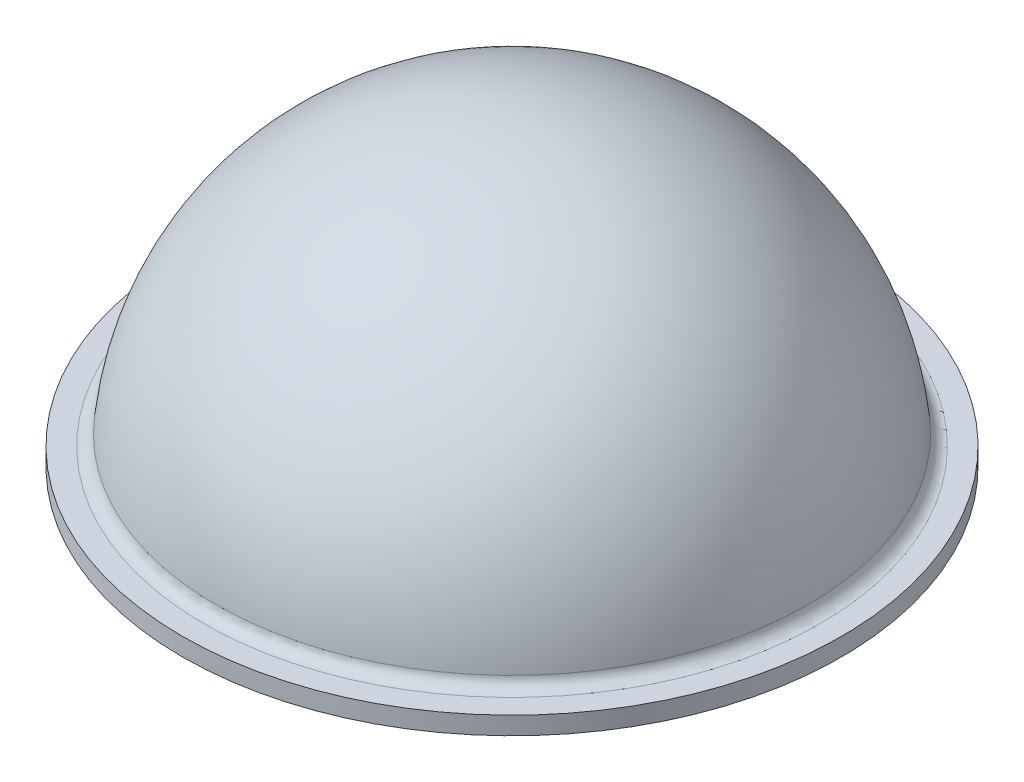
ISO-10303-21;
HEADER;
FILE_DESCRIPTION(('STEP AP214'),'2;1');
FILE_NAME('part.step','',(''),(''),'','','');
FILE_SCHEMA(('AUTOMOTIVE_DESIGN { 1 0 10303 214 1 1 1 1 }'));
ENDSEC;
DATA;
#1=APPLICATION_CONTEXT('core data for automotive mechanical design processes');
#2=APPLICATION_PROTOCOL_DEFINITION('international standard','automotive_design',2000,#1);
#3=PRODUCT_CONTEXT('',#1,'mechanical');
#4=PRODUCT('Part','Part','',(#3));
#5=PRODUCT_RELATED_PRODUCT_CATEGORY('part','',(#4));
#6=PRODUCT_DEFINITION_FORMATION('','',#4);
#7=PRODUCT_DEFINITION_CONTEXT('part definition',#1,'design');
#8=PRODUCT_DEFINITION('design','',#6,#7);
#9=PRODUCT_DEFINITION_SHAPE('','',#8);
#10=(LENGTH_UNIT() NAMED_UNIT(*) SI_UNIT(.MILLI.,.METRE.));
#11=(NAMED_UNIT(*) PLANE_ANGLE_UNIT() SI_UNIT($,.RADIAN.));
#12=(NAMED_UNIT(*) SI_UNIT($,.STERADIAN.) SOLID_ANGLE_UNIT());
#13=UNCERTAINTY_MEASURE_WITH_UNIT(LENGTH_MEASURE(1.E-05),#10,'distance_accuracy_value','');
#14=(GEOMETRIC_REPRESENTATION_CONTEXT(3) GLOBAL_UNCERTAINTY_ASSIGNED_CONTEXT((#13)) GLOBAL_UNIT_ASSIGNED_CONTEXT((#10,
#11,#12)) REPRESENTATION_CONTEXT('',''));
#15=CARTESIAN_POINT('',(0.,0.,0.));
#16=DIRECTION('',(0.,0.,1.));
#17=DIRECTION('',(1.,0.,0.));
#18=AXIS2_PLACEMENT_3D('',#15,#16,#17);
#19=CARTESIAN_POINT('',(0.,3.,0.));
#20=DIRECTION('',(0.,-1.,0.));
#21=DIRECTION('',(0.,0.,-1.));
#22=AXIS2_PLACEMENT_3D('',#19,#20,#21);
#23=TOROIDAL_SURFACE('',#22,49.9099188538711,3.);
#24=CARTESIAN_POINT('',(0.,2.82,0.));
#25=DIRECTION('',(0.,-1.,0.));
#26=DIRECTION('',(0.,0.,-1.));
#27=AXIS2_PLACEMENT_3D('',#24,#25,#26);
#28=CIRCLE('',#27,46.9153237226389);
#29=CARTESIAN_POINT('',(0.,2.82,-46.9153237226389));
#30=VERTEX_POINT('',#29);
#31=EDGE_CURVE('E10',#30,#30,#28,.T.);
#32=ORIENTED_EDGE('',*,*,#31,.F.);
#33=EDGE_LOOP('',(#32));
#34=FACE_BOUND('',#33,.T.);
#35=CARTESIAN_POINT('',(0.,0.,0.));
#36=DIRECTION('',(0.,-1.,0.));
#37=DIRECTION('',(0.,0.,-1.));
#38=AXIS2_PLACEMENT_3D('',#35,#36,#37);
#39=CIRCLE('',#38,49.9099188538711);
#40=CARTESIAN_POINT('',(0.,0.,-49.9099188538711));
#41=VERTEX_POINT('',#40);
#42=EDGE_CURVE('E52',#41,#41,#39,.T.);
#43=ORIENTED_EDGE('',*,*,#42,.T.);
#44=EDGE_LOOP('',(#43));
#45=FACE_BOUND('',#44,.T.);
#46=ADVANCED_FACE('F30',(#34,#45),#23,.T.);
#47=CARTESIAN_POINT('',(0.,0.,0.));
#48=DIRECTION('',(0.,-1.,0.));
#49=DIRECTION('',(1.,0.,0.));
#50=AXIS2_PLACEMENT_3D('',#47,#48,#49);
#51=SPHERICAL_SURFACE('',#50,47.);
#52=ORIENTED_EDGE('',*,*,#31,.T.);
#53=EDGE_LOOP('',(#52));
#54=FACE_BOUND('',#53,.T.);
#55=ADVANCED_FACE('F69',(#54),#51,.F.);
#56=CARTESIAN_POINT('',(0.,0.,0.));
#57=DIRECTION('',(0.,-1.,0.));
#58=DIRECTION('',(1.,0.,0.));
#59=AXIS2_PLACEMENT_3D('',#56,#57,#58);
#60=SPHERICAL_SURFACE('',#59,50.);
#61=CARTESIAN_POINT('',(0.,4.80769230769231,0.));
#62=DIRECTION('',(0.,-1.,0.));
#63=DIRECTION('',(0.,0.,-1.));
#64=AXIS2_PLACEMENT_3D('',#61,#62,#63);
#65=CIRCLE('',#64,49.768324210029);
#66=CARTESIAN_POINT('',(0.,4.80769230769231,-49.768324210029));
#67=VERTEX_POINT('',#66);
#68=EDGE_CURVE('E36',#67,#67,#65,.T.);
#69=ORIENTED_EDGE('',*,*,#68,.F.);
#70=EDGE_LOOP('',(#69));
#71=FACE_BOUND('',#70,.T.);
#72=ADVANCED_FACE('F74',(#71),#60,.T.);
#73=CARTESIAN_POINT('',(0.,5.,0.));
#74=DIRECTION('',(0.,-1.,0.));
#75=DIRECTION('',(0.,0.,-1.));
#76=AXIS2_PLACEMENT_3D('',#73,#74,#75);
#77=TOROIDAL_SURFACE('',#76,51.7590571784301,2.);
#78=CARTESIAN_POINT('',(0.,3.,0.));
#79=DIRECTION('',(0.,-1.,0.));
#80=DIRECTION('',(0.,0.,-1.));
#81=AXIS2_PLACEMENT_3D('',#78,#79,#80);
#82=CIRCLE('',#81,51.7590571784301);
#83=CARTESIAN_POINT('',(0.,3.,-51.7590571784301));
#84=VERTEX_POINT('',#83);
#85=EDGE_CURVE('E40',#84,#84,#82,.T.);
#86=ORIENTED_EDGE('',*,*,#85,.F.);
#87=EDGE_LOOP('',(#86));
#88=FACE_BOUND('',#87,.T.);
#89=ORIENTED_EDGE('',*,*,#68,.T.);
#90=EDGE_LOOP('',(#89));
#91=FACE_BOUND('',#90,.T.);
#92=ADVANCED_FACE('F78',(#88,#91),#77,.F.);
#93=CARTESIAN_POINT('',(55.4099188538711,3.,0.));
#94=DIRECTION('',(0.,1.,0.));
#95=DIRECTION('',(0.,0.,1.));
#96=AXIS2_PLACEMENT_3D('',#93,#94,#95);
#97=PLANE('',#96);
#98=ORIENTED_EDGE('',*,*,#85,.T.);
#99=EDGE_LOOP('',(#98));
#100=FACE_BOUND('',#99,.T.);
#101=CARTESIAN_POINT('',(0.,3.,0.));
#102=DIRECTION('',(0.,-1.,0.));
#103=DIRECTION('',(0.,0.,-1.));
#104=AXIS2_PLACEMENT_3D('',#101,#102,#103);
#105=CIRCLE('',#104,55.4099188538711);
#106=CARTESIAN_POINT('',(0.,3.,-55.4099188538711));
#107=VERTEX_POINT('',#106);
#108=EDGE_CURVE('E44',#107,#107,#105,.T.);
#109=ORIENTED_EDGE('',*,*,#108,.F.);
#110=EDGE_LOOP('',(#109));
#111=FACE_BOUND('',#110,.T.);
#112=ADVANCED_FACE('F65',(#100,#111),#97,.T.);
#113=CARTESIAN_POINT('',(0.,0.,0.));
#114=DIRECTION('',(0.,-1.,0.));
#115=DIRECTION('',(0.,0.,-1.));
#116=AXIS2_PLACEMENT_3D('',#113,#114,#115);
#117=CYLINDRICAL_SURFACE('',#116,55.4099188538711);
#118=ORIENTED_EDGE('',*,*,#108,.T.);
#119=EDGE_LOOP('',(#118));
#120=FACE_BOUND('',#119,.T.);
#121=CARTESIAN_POINT('',(0.,0.,0.));
#122=DIRECTION('',(0.,-1.,0.));
#123=DIRECTION('',(0.,0.,-1.));
#124=AXIS2_PLACEMENT_3D('',#121,#122,#123);
#125=CIRCLE('',#124,55.4099188538711);
#126=CARTESIAN_POINT('',(0.,0.,-55.4099188538711));
#127=VERTEX_POINT('',#126);
#128=EDGE_CURVE('E49',#127,#127,#125,.T.);
#129=ORIENTED_EDGE('',*,*,#128,.F.);
#130=EDGE_LOOP('',(#129));
#131=FACE_BOUND('',#130,.T.);
#132=ADVANCED_FACE('F59',(#120,#131),#117,.T.);
#133=CARTESIAN_POINT('',(49.9099188538711,0.,0.));
#134=DIRECTION('',(0.,-1.,0.));
#135=DIRECTION('',(0.,0.,-1.));
#136=AXIS2_PLACEMENT_3D('',#133,#134,#135);
#137=PLANE('',#136);
#138=ORIENTED_EDGE('',*,*,#128,.T.);
#139=EDGE_LOOP('',(#138));
#140=FACE_BOUND('',#139,.T.);
#141=ORIENTED_EDGE('',*,*,#42,.F.);
#142=EDGE_LOOP('',(#141));
#143=FACE_BOUND('',#142,.T.);
#144=ADVANCED_FACE('F57',(#140,#143),#137,.T.);
#145=CLOSED_SHELL('',(#46,#55,#72,#92,#112,#132,#144));
#146=MANIFOLD_SOLID_BREP('B2',#145);
#147=ADVANCED_BREP_SHAPE_REPRESENTATION('',(#18,#146),#14);
#148=SHAPE_DEFINITION_REPRESENTATION(#9,#147);
ENDSEC;
END-ISO-10303-21;
